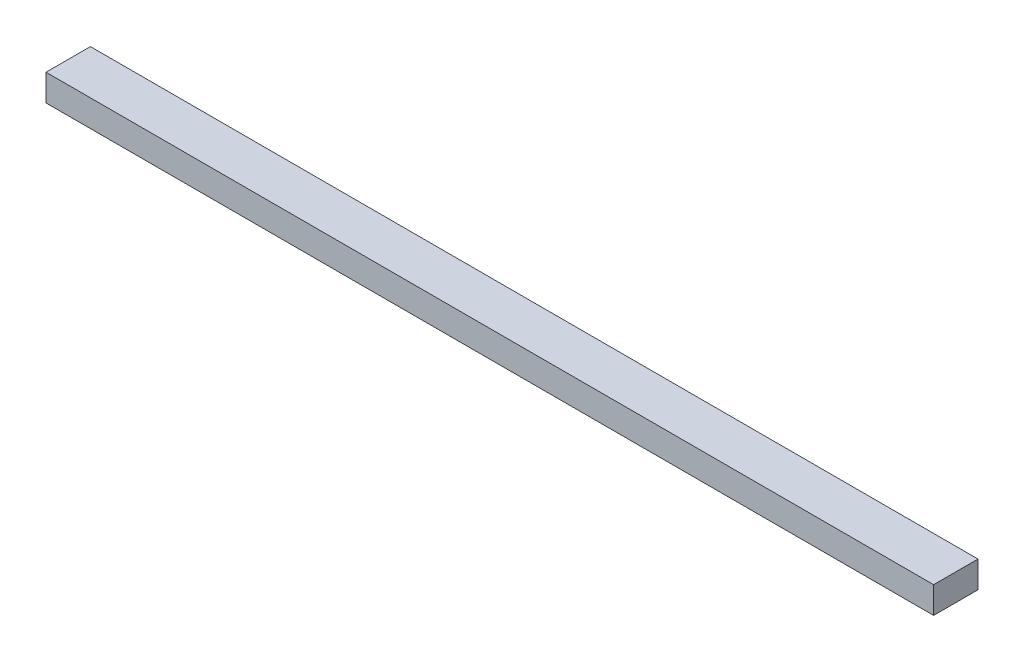
ISO-10303-21;
HEADER;
FILE_DESCRIPTION(('STEP AP214'),'2;1');
FILE_NAME('part.step','',(''),(''),'','','');
FILE_SCHEMA(('AUTOMOTIVE_DESIGN { 1 0 10303 214 1 1 1 1 }'));
ENDSEC;
DATA;
#1=APPLICATION_CONTEXT('core data for automotive mechanical design processes');
#2=APPLICATION_PROTOCOL_DEFINITION('international standard','automotive_design',2000,#1);
#3=PRODUCT_CONTEXT('',#1,'mechanical');
#4=PRODUCT('Part','Part','',(#3));
#5=PRODUCT_RELATED_PRODUCT_CATEGORY('part','',(#4));
#6=PRODUCT_DEFINITION_FORMATION('','',#4);
#7=PRODUCT_DEFINITION_CONTEXT('part definition',#1,'design');
#8=PRODUCT_DEFINITION('design','',#6,#7);
#9=PRODUCT_DEFINITION_SHAPE('','',#8);
#10=(LENGTH_UNIT() NAMED_UNIT(*) SI_UNIT(.MILLI.,.METRE.));
#11=(NAMED_UNIT(*) PLANE_ANGLE_UNIT() SI_UNIT($,.RADIAN.));
#12=(NAMED_UNIT(*) SI_UNIT($,.STERADIAN.) SOLID_ANGLE_UNIT());
#13=UNCERTAINTY_MEASURE_WITH_UNIT(LENGTH_MEASURE(1.E-05),#10,'distance_accuracy_value','');
#14=(GEOMETRIC_REPRESENTATION_CONTEXT(3) GLOBAL_UNCERTAINTY_ASSIGNED_CONTEXT((#13)) GLOBAL_UNIT_ASSIGNED_CONTEXT((#10,
#11,#12)) REPRESENTATION_CONTEXT('',''));
#15=CARTESIAN_POINT('',(0.,0.,0.));
#16=DIRECTION('',(0.,0.,1.));
#17=DIRECTION('',(1.,0.,0.));
#18=AXIS2_PLACEMENT_3D('',#15,#16,#17);
#19=CARTESIAN_POINT('',(0.,3.,0.));
#20=DIRECTION('',(1.,0.,0.));
#21=DIRECTION('',(0.,0.,-1.));
#22=AXIS2_PLACEMENT_3D('',#19,#20,#21);
#23=PLANE('',#22);
#24=DIRECTION('',(0.,0.,1.));
#25=VECTOR('',#24,1.);
#26=CARTESIAN_POINT('',(0.,0.,0.));
#27=LINE('',#26,#25);
#28=CARTESIAN_POINT('',(0.,0.,-5.));
#29=VERTEX_POINT('',#28);
#30=CARTESIAN_POINT('',(0.,0.,0.));
#31=VERTEX_POINT('',#30);
#32=EDGE_CURVE('E96',#29,#31,#27,.T.);
#33=ORIENTED_EDGE('',*,*,#32,.T.);
#34=DIRECTION('',(0.,-1.,0.));
#35=VECTOR('',#34,1.);
#36=CARTESIAN_POINT('',(0.,3.,0.));
#37=LINE('',#36,#35);
#38=CARTESIAN_POINT('',(0.,3.,0.));
#39=VERTEX_POINT('',#38);
#40=EDGE_CURVE('E11',#39,#31,#37,.T.);
#41=ORIENTED_EDGE('',*,*,#40,.F.);
#42=DIRECTION('',(0.,0.,1.));
#43=VECTOR('',#42,1.);
#44=CARTESIAN_POINT('',(0.,3.,0.));
#45=LINE('',#44,#43);
#46=CARTESIAN_POINT('',(0.,3.,-5.));
#47=VERTEX_POINT('',#46);
#48=EDGE_CURVE('E84',#47,#39,#45,.T.);
#49=ORIENTED_EDGE('',*,*,#48,.F.);
#50=DIRECTION('',(0.,-1.,0.));
#51=VECTOR('',#50,1.);
#52=CARTESIAN_POINT('',(0.,3.,-5.));
#53=LINE('',#52,#51);
#54=EDGE_CURVE('E92',#47,#29,#53,.T.);
#55=ORIENTED_EDGE('',*,*,#54,.T.);
#56=EDGE_LOOP('',(#33,#41,#49,#55));
#57=FACE_BOUND('',#56,.T.);
#58=ADVANCED_FACE('F33',(#57),#23,.F.);
#59=CARTESIAN_POINT('',(0.,3.,0.));
#60=DIRECTION('',(0.,0.,-1.));
#61=DIRECTION('',(-1.,0.,0.));
#62=AXIS2_PLACEMENT_3D('',#59,#60,#61);
#63=PLANE('',#62);
#64=DIRECTION('',(1.,0.,0.));
#65=VECTOR('',#64,1.);
#66=CARTESIAN_POINT('',(0.,0.,0.));
#67=LINE('',#66,#65);
#68=CARTESIAN_POINT('',(100.,0.,0.));
#69=VERTEX_POINT('',#68);
#70=EDGE_CURVE('E88',#31,#69,#67,.T.);
#71=ORIENTED_EDGE('',*,*,#70,.T.);
#72=DIRECTION('',(0.,-1.,0.));
#73=VECTOR('',#72,1.);
#74=CARTESIAN_POINT('',(100.,3.,0.));
#75=LINE('',#74,#73);
#76=CARTESIAN_POINT('',(100.,3.,0.));
#77=VERTEX_POINT('',#76);
#78=EDGE_CURVE('E41',#77,#69,#75,.T.);
#79=ORIENTED_EDGE('',*,*,#78,.F.);
#80=DIRECTION('',(1.,0.,0.));
#81=VECTOR('',#80,1.);
#82=CARTESIAN_POINT('',(0.,3.,0.));
#83=LINE('',#82,#81);
#84=EDGE_CURVE('E79',#39,#77,#83,.T.);
#85=ORIENTED_EDGE('',*,*,#84,.F.);
#86=ORIENTED_EDGE('',*,*,#40,.T.);
#87=EDGE_LOOP('',(#71,#79,#85,#86));
#88=FACE_BOUND('',#87,.T.);
#89=ADVANCED_FACE('F87',(#88),#63,.F.);
#90=CARTESIAN_POINT('',(100.,3.,0.));
#91=DIRECTION('',(-1.,0.,0.));
#92=DIRECTION('',(0.,0.,1.));
#93=AXIS2_PLACEMENT_3D('',#90,#91,#92);
#94=PLANE('',#93);
#95=DIRECTION('',(0.,0.,-1.));
#96=VECTOR('',#95,1.);
#97=CARTESIAN_POINT('',(100.,0.,0.));
#98=LINE('',#97,#96);
#99=CARTESIAN_POINT('',(100.,0.,-5.));
#100=VERTEX_POINT('',#99);
#101=EDGE_CURVE('E66',#69,#100,#98,.T.);
#102=ORIENTED_EDGE('',*,*,#101,.T.);
#103=DIRECTION('',(0.,-1.,0.));
#104=VECTOR('',#103,1.);
#105=CARTESIAN_POINT('',(100.,3.,-5.));
#106=LINE('',#105,#104);
#107=CARTESIAN_POINT('',(100.,3.,-5.));
#108=VERTEX_POINT('',#107);
#109=EDGE_CURVE('E89',#108,#100,#106,.T.);
#110=ORIENTED_EDGE('',*,*,#109,.F.);
#111=DIRECTION('',(0.,0.,-1.));
#112=VECTOR('',#111,1.);
#113=CARTESIAN_POINT('',(100.,3.,0.));
#114=LINE('',#113,#112);
#115=EDGE_CURVE('E82',#77,#108,#114,.T.);
#116=ORIENTED_EDGE('',*,*,#115,.F.);
#117=ORIENTED_EDGE('',*,*,#78,.T.);
#118=EDGE_LOOP('',(#102,#110,#116,#117));
#119=FACE_BOUND('',#118,.T.);
#120=ADVANCED_FACE('F90',(#119),#94,.F.);
#121=CARTESIAN_POINT('',(0.,3.,-5.));
#122=DIRECTION('',(0.,0.,1.));
#123=DIRECTION('',(1.,0.,0.));
#124=AXIS2_PLACEMENT_3D('',#121,#122,#123);
#125=PLANE('',#124);
#126=DIRECTION('',(-1.,0.,0.));
#127=VECTOR('',#126,1.);
#128=CARTESIAN_POINT('',(0.,0.,-5.));
#129=LINE('',#128,#127);
#130=EDGE_CURVE('E72',#100,#29,#129,.T.);
#131=ORIENTED_EDGE('',*,*,#130,.T.);
#132=ORIENTED_EDGE('',*,*,#54,.F.);
#133=DIRECTION('',(-1.,0.,0.));
#134=VECTOR('',#133,1.);
#135=CARTESIAN_POINT('',(0.,3.,-5.));
#136=LINE('',#135,#134);
#137=EDGE_CURVE('E49',#108,#47,#136,.T.);
#138=ORIENTED_EDGE('',*,*,#137,.F.);
#139=ORIENTED_EDGE('',*,*,#109,.T.);
#140=EDGE_LOOP('',(#131,#132,#138,#139));
#141=FACE_BOUND('',#140,.T.);
#142=ADVANCED_FACE('F103',(#141),#125,.F.);
#143=CARTESIAN_POINT('',(0.,3.,0.));
#144=DIRECTION('',(0.,-1.,0.));
#145=DIRECTION('',(0.,0.,-1.));
#146=AXIS2_PLACEMENT_3D('',#143,#144,#145);
#147=PLANE('',#146);
#148=ORIENTED_EDGE('',*,*,#48,.T.);
#149=ORIENTED_EDGE('',*,*,#84,.T.);
#150=ORIENTED_EDGE('',*,*,#115,.T.);
#151=ORIENTED_EDGE('',*,*,#137,.T.);
#152=EDGE_LOOP('',(#148,#149,#150,#151));
#153=FACE_BOUND('',#152,.T.);
#154=ADVANCED_FACE('F80',(#153),#147,.F.);
#155=CARTESIAN_POINT('',(0.,0.,0.));
#156=DIRECTION('',(0.,-1.,0.));
#157=DIRECTION('',(0.,0.,-1.));
#158=AXIS2_PLACEMENT_3D('',#155,#156,#157);
#159=PLANE('',#158);
#160=ORIENTED_EDGE('',*,*,#32,.F.);
#161=ORIENTED_EDGE('',*,*,#130,.F.);
#162=ORIENTED_EDGE('',*,*,#101,.F.);
#163=ORIENTED_EDGE('',*,*,#70,.F.);
#164=EDGE_LOOP('',(#160,#161,#162,#163));
#165=FACE_BOUND('',#164,.T.);
#166=ADVANCED_FACE('F106',(#165),#159,.T.);
#167=CLOSED_SHELL('',(#58,#89,#120,#142,#154,#166));
#168=MANIFOLD_SOLID_BREP('B2',#167);
#169=ADVANCED_BREP_SHAPE_REPRESENTATION('',(#18,#168),#14);
#170=SHAPE_DEFINITION_REPRESENTATION(#9,#169);
ENDSEC;
END-ISO-10303-21;
